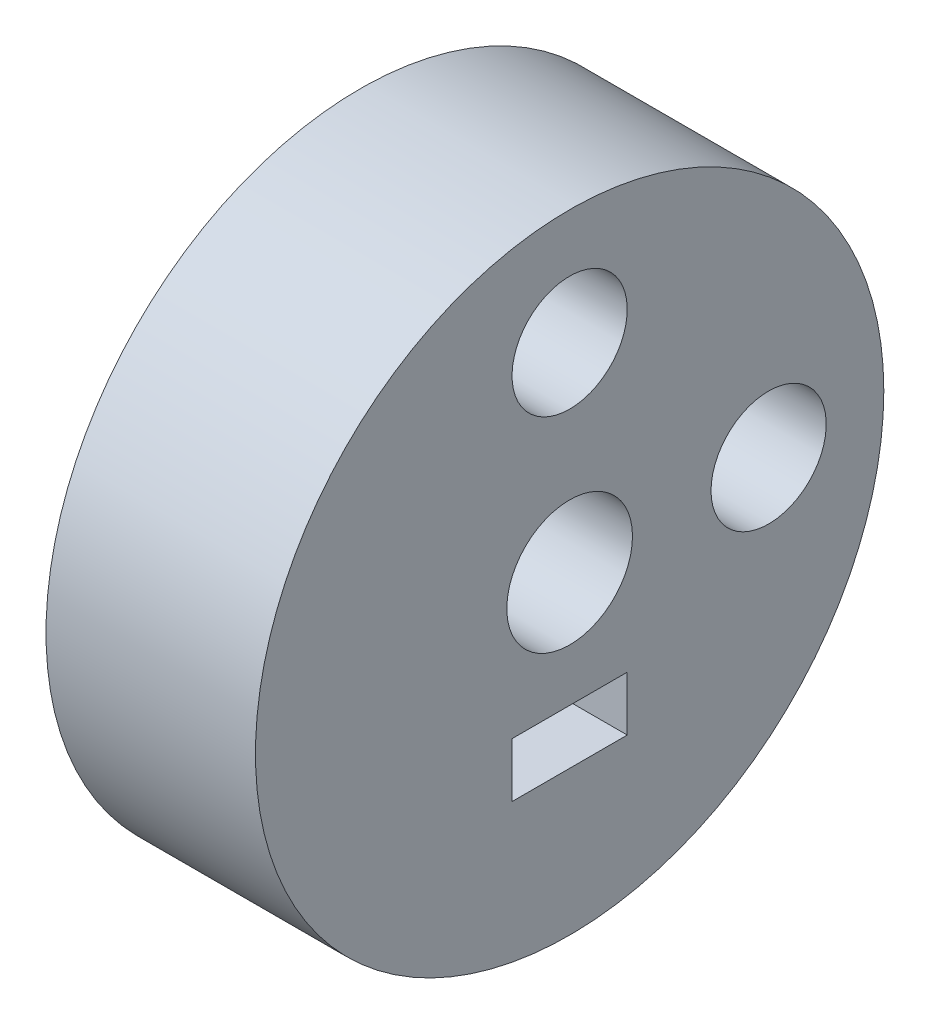
ISO-10303-21;
HEADER;
FILE_DESCRIPTION(('STEP AP214'),'2;1');
FILE_NAME('part.step','',(''),(''),'','','');
FILE_SCHEMA(('AUTOMOTIVE_DESIGN { 1 0 10303 214 1 1 1 1 }'));
ENDSEC;
DATA;
#1=APPLICATION_CONTEXT('core data for automotive mechanical design processes');
#2=APPLICATION_PROTOCOL_DEFINITION('international standard','automotive_design',2000,#1);
#3=PRODUCT_CONTEXT('',#1,'mechanical');
#4=PRODUCT('Part','Part','',(#3));
#5=PRODUCT_RELATED_PRODUCT_CATEGORY('part','',(#4));
#6=PRODUCT_DEFINITION_FORMATION('','',#4);
#7=PRODUCT_DEFINITION_CONTEXT('part definition',#1,'design');
#8=PRODUCT_DEFINITION('design','',#6,#7);
#9=PRODUCT_DEFINITION_SHAPE('','',#8);
#10=(LENGTH_UNIT() NAMED_UNIT(*) SI_UNIT(.MILLI.,.METRE.));
#11=(NAMED_UNIT(*) PLANE_ANGLE_UNIT() SI_UNIT($,.RADIAN.));
#12=(NAMED_UNIT(*) SI_UNIT($,.STERADIAN.) SOLID_ANGLE_UNIT());
#13=UNCERTAINTY_MEASURE_WITH_UNIT(LENGTH_MEASURE(1.E-05),#10,'distance_accuracy_value','');
#14=(GEOMETRIC_REPRESENTATION_CONTEXT(3) GLOBAL_UNCERTAINTY_ASSIGNED_CONTEXT((#13)) GLOBAL_UNIT_ASSIGNED_CONTEXT((#10,
#11,#12)) REPRESENTATION_CONTEXT('',''));
#15=CARTESIAN_POINT('',(0.,0.,0.));
#16=DIRECTION('',(0.,0.,1.));
#17=DIRECTION('',(1.,0.,0.));
#18=AXIS2_PLACEMENT_3D('',#15,#16,#17);
#19=CARTESIAN_POINT('',(-5.,-15.,0.));
#20=DIRECTION('',(0.,1.,0.));
#21=DIRECTION('',(0.,0.,1.));
#22=AXIS2_PLACEMENT_3D('',#19,#20,#21);
#23=CYLINDRICAL_SURFACE('',#22,1.5);
#24=CARTESIAN_POINT('',(-5.,-5.5,0.));
#25=DIRECTION('',(0.,1.,0.));
#26=DIRECTION('',(0.,0.,1.));
#27=AXIS2_PLACEMENT_3D('',#24,#25,#26);
#28=CIRCLE('',#27,1.5);
#29=CARTESIAN_POINT('',(-5.,-5.5,1.5));
#30=VERTEX_POINT('',#29);
#31=EDGE_CURVE('E164',#30,#30,#28,.F.);
#32=ORIENTED_EDGE('',*,*,#31,.T.);
#33=EDGE_LOOP('',(#32));
#34=FACE_BOUND('',#33,.T.);
#35=CARTESIAN_POINT('',(-5.,-2.59807621135331,1.5));
#36=CARTESIAN_POINT('',(-5.07816171229288,-2.59808302092689,1.4999945446118));
#37=CARTESIAN_POINT('',(-5.15642211728757,-2.60165701781635,1.49384995609983));
#38=CARTESIAN_POINT('',(-5.31054089701573,-2.61543549678078,1.46958481484708));
#39=CARTESIAN_POINT('',(-5.38639387256511,-2.62565391083339,1.45143909683127));
#40=CARTESIAN_POINT('',(-5.53317749651591,-2.65124019908097,1.40414992304972));
#41=CARTESIAN_POINT('',(-5.60413197871038,-2.66658065209878,1.3750649287406));
#42=CARTESIAN_POINT('',(-5.74013630299508,-2.70063997225287,1.30690128806456));
#43=CARTESIAN_POINT('',(-5.80518582539369,-2.71935902214097,1.26782210105366));
#44=CARTESIAN_POINT('',(-5.93345859283626,-2.75995303586162,1.17699981079632));
#45=CARTESIAN_POINT('',(-5.99608870351032,-2.7819609545693,1.12447805421566));
#46=CARTESIAN_POINT('',(-6.11211258261007,-2.82557974178558,1.0098807114217));
#47=CARTESIAN_POINT('',(-6.16550174387528,-2.84719040746875,0.947800388673441));
#48=CARTESIAN_POINT('',(-6.26505072672149,-2.88932215429423,0.810734345121821));
#49=CARTESIAN_POINT('',(-6.3104806517893,-2.90967159627258,0.735160783518864));
#50=CARTESIAN_POINT('',(-6.38771127986865,-2.94526134149293,0.576235539899257));
#51=CARTESIAN_POINT('',(-6.41952058420576,-2.96050486775612,0.492888807207234));
#52=CARTESIAN_POINT('',(-6.46625699195165,-2.98320691866356,0.327067415888967));
#53=CARTESIAN_POINT('',(-6.4822242895333,-2.99114220331338,0.244952685733227));
#54=CARTESIAN_POINT('',(-6.50024917801256,-3.000113757691,0.0788559430467733));
#55=CARTESIAN_POINT('',(-6.50231518519357,-3.00115420176885,-0.00512490876560655));
#56=CARTESIAN_POINT('',(-6.49287998904448,-2.99644472874675,-0.164748786635624));
#57=CARTESIAN_POINT('',(-6.48254297671817,-2.99127743838241,-0.240481798765186));
#58=CARTESIAN_POINT('',(-6.45067873414302,-2.97561367889621,-0.388970657877482));
#59=CARTESIAN_POINT('',(-6.42915066653567,-2.96511681099591,-0.461726281640887));
#60=CARTESIAN_POINT('',(-6.37537615086528,-2.93957374931481,-0.603464087354329));
#61=CARTESIAN_POINT('',(-6.3429855302419,-2.92446662293799,-0.672380135272767));
#62=CARTESIAN_POINT('',(-6.26860487569776,-2.89106468980031,-0.803965202269992));
#63=CARTESIAN_POINT('',(-6.22661140504648,-2.87276874236226,-0.866631973257968));
#64=CARTESIAN_POINT('',(-6.12965697270048,-2.83266591598844,-0.990260491347292));
#65=CARTESIAN_POINT('',(-6.07384545751099,-2.81069063997263,-1.05050111254404));
#66=CARTESIAN_POINT('',(-5.95311541260474,-2.76681510880217,-1.16115655544667));
#67=CARTESIAN_POINT('',(-5.88818994158891,-2.74491492398443,-1.21156381736135));
#68=CARTESIAN_POINT('',(-5.74602771136387,-2.70216234138727,-1.30425800196332));
#69=CARTESIAN_POINT('',(-5.66827096541869,-2.68146479986061,-1.34582597246708));
#70=CARTESIAN_POINT('',(-5.50559349296151,-2.64563175417864,-1.41497866950185));
#71=CARTESIAN_POINT('',(-5.42068035047366,-2.63049045069101,-1.44257798731633));
#72=CARTESIAN_POINT('',(-5.25317823307582,-2.60916953725551,-1.48077031653756));
#73=CARTESIAN_POINT('',(-5.17093832143467,-2.60237483772744,-1.49253768317996));
#74=CARTESIAN_POINT('',(-5.00539798772519,-2.59676879042414,-1.50227541991714));
#75=CARTESIAN_POINT('',(-4.92209835632032,-2.59795180333967,-1.50025553597254));
#76=CARTESIAN_POINT('',(-4.76651912213191,-2.60751504810877,-1.48355406501595));
#77=CARTESIAN_POINT('',(-4.69403082333811,-2.61509381259981,-1.4702817250687));
#78=CARTESIAN_POINT('',(-4.55244832059356,-2.63541032327011,-1.43354442694866));
#79=CARTESIAN_POINT('',(-4.48335522388009,-2.64814974007551,-1.41007616793542));
#80=CARTESIAN_POINT('',(-4.34688300364596,-2.67804333119485,-1.35247138290733));
#81=CARTESIAN_POINT('',(-4.27973147471967,-2.69537464864595,-1.31789109553908));
#82=CARTESIAN_POINT('',(-4.15179609269151,-2.73234179245874,-1.23943059602371));
#83=CARTESIAN_POINT('',(-4.09101553473008,-2.75197880032721,-1.19554560649832));
#84=CARTESIAN_POINT('',(-3.96953184871468,-2.79431997684504,-1.09325575079828));
#85=CARTESIAN_POINT('',(-3.90980427392351,-2.81709874731433,-1.03371790847245));
#86=CARTESIAN_POINT('',(-3.80088164300961,-2.86101352466839,-0.905106743097434));
#87=CARTESIAN_POINT('',(-3.75169014465419,-2.88214897511564,-0.836030211983021));
#88=CARTESIAN_POINT('',(-3.66413941107485,-2.92112042536435,-0.687803043838136));
#89=CARTESIAN_POINT('',(-3.62610032268364,-2.93885462508044,-0.60843464636117));
#90=CARTESIAN_POINT('',(-3.56429314421391,-2.96825032438951,-0.443283546961623));
#91=CARTESIAN_POINT('',(-3.54051252295054,-2.97991715514559,-0.357506552088264));
#92=CARTESIAN_POINT('',(-3.50994715373801,-2.99501262272824,-0.190469523495626));
#93=CARTESIAN_POINT('',(-3.50180318618583,-2.99909891862287,-0.109517165775686));
#94=CARTESIAN_POINT('',(-3.4987351018184,-3.00063195562697,0.0526889789268054));
#95=CARTESIAN_POINT('',(-3.50380635721465,-2.99808102100335,0.13394265044263));
#96=CARTESIAN_POINT('',(-3.52612461019344,-2.98700953256884,0.288806988475721));
#97=CARTESIAN_POINT('',(-3.54254727388651,-2.97889342001985,0.362568476716896));
#98=CARTESIAN_POINT('',(-3.58599049895446,-2.95788140495135,0.506168928275426));
#99=CARTESIAN_POINT('',(-3.61301258014018,-2.94498481699193,0.576007327433263));
#100=CARTESIAN_POINT('',(-3.67809057824896,-2.9148889612218,0.713135109367327));
#101=CARTESIAN_POINT('',(-3.71656898481176,-2.89752925798198,0.780187714050069));
#102=CARTESIAN_POINT('',(-3.80293689628858,-2.86032199712739,0.907161962721037));
#103=CARTESIAN_POINT('',(-3.85083072367351,-2.84047329837541,0.967080311122361));
#104=CARTESIAN_POINT('',(-3.96019570853405,-2.79792915339941,1.08437100623534));
#105=CARTESIAN_POINT('',(-4.02254373121579,-2.77514698517547,1.14089652680891));
#106=CARTESIAN_POINT('',(-4.15617608169465,-2.73094614244278,1.24299493109201));
#107=CARTESIAN_POINT('',(-4.22746823130153,-2.70952868642798,1.28855812501509));
#108=CARTESIAN_POINT('',(-4.37995496987143,-2.66999407957374,1.36864661967848));
#109=CARTESIAN_POINT('',(-4.4613912966931,-2.65200261384405,1.40277759894141));
#110=CARTESIAN_POINT('',(-4.62999860650967,-2.62299234492527,1.45631806425962));
#111=CARTESIAN_POINT('',(-4.71714933336903,-2.61195024221553,1.47577678676302));
#112=CARTESIAN_POINT('',(-4.83770803347799,-2.60293908902686,1.49155051179662));
#113=CARTESIAN_POINT('',(-4.87005184159682,-2.60112193507727,1.49471415744578));
#114=CARTESIAN_POINT('',(-4.93492472102337,-2.59868903831625,1.49894010763495));
#115=CARTESIAN_POINT('',(-4.96745380457881,-2.59807337587664,1.50000227159981));
#116=CARTESIAN_POINT('',(-5.,-2.59807621135331,1.5));
#117=B_SPLINE_CURVE_WITH_KNOTS('',3,(#35,#36,#37,#38,#39,#40,#41,#42,#43,#44,#45,#46,#47,#48,
#49,#50,#51,#52,#53,#54,#55,#56,#57,#58,#59,#60,#61,#62,#63,#64,#65,#66,#67,#68,#69,#70,#71,#72,
#73,#74,#75,#76,#77,#78,#79,#80,#81,#82,#83,#84,#85,#86,#87,#88,#89,#90,#91,#92,#93,#94,#95,#96,
#97,#98,#99,#100,#101,#102,#103,#104,#105,#106,#107,#108,#109,#110,#111,#112,#113,#114,#115,
#116),.UNSPECIFIED.,.T.,.F.,(4,2,2,2,2,2,2,2,2,2,2,2,2,2,2,2,2,2,2,2,2,2,2,2,2,2,2,2,2,2,2,2,2,
2,2,2,2,2,2,2,4),(0.,0.234348183892073,0.469189339237207,0.702792893878328,0.936409088167725,
1.18929346874735,1.44230356626556,1.71236838358145,1.98226240445837,2.23295227451903,
2.4834903552906,2.71224146226808,2.94100968776183,3.1729430209672,3.40495949025408,
3.65890787185336,3.91305072368878,4.18333262594173,4.45333161317558,4.70193436281318,
4.9503613978256,5.17161275136039,5.39293578654095,5.62450944609132,5.85620229330071,
6.1171011537092,6.37808797467304,6.64596272119449,6.91360169713158,7.15668405584231,
7.39968130190958,7.62666637307239,7.8536840026802,8.09041126079208,8.32724745151079,
8.58765362775102,8.84828914267732,9.11716123557908,9.38512699504141,9.48270202777964,
9.58028358741811),.UNSPECIFIED.);
#118=CARTESIAN_POINT('',(-5.,-2.59807621135331,1.5));
#119=VERTEX_POINT('',#118);
#120=EDGE_CURVE('E149',#119,#119,#117,.T.);
#121=ORIENTED_EDGE('',*,*,#120,.F.);
#122=EDGE_LOOP('',(#121));
#123=FACE_BOUND('',#122,.T.);
#124=ADVANCED_FACE('F41',(#34,#123),#23,.F.);
#125=CARTESIAN_POINT('',(-10.,0.,0.));
#126=DIRECTION('',(1.,0.,0.));
#127=DIRECTION('',(0.,0.,-1.));
#128=AXIS2_PLACEMENT_3D('',#125,#126,#127);
#129=CYLINDRICAL_SURFACE('',#128,15.);
#130=CARTESIAN_POINT('',(-2.25,-15.,0.));
#131=CARTESIAN_POINT('',(-2.25000591468106,-14.9999972510161,0.153093900309382));
#132=CARTESIAN_POINT('',(-2.26282742180987,-14.9976319814164,0.306265477031471));
#133=CARTESIAN_POINT('',(-2.31374411502345,-14.9884243838124,0.608296581609692));
#134=CARTESIAN_POINT('',(-2.35186103096257,-14.9815782065834,0.757152287098164));
#135=CARTESIAN_POINT('',(-2.45216567272287,-14.9641750561343,1.04613957267399));
#136=CARTESIAN_POINT('',(-2.51433208495394,-14.9536213694109,1.18627875038933));
#137=CARTESIAN_POINT('',(-2.6609114945878,-14.9299573070775,1.45412377239283));
#138=CARTESIAN_POINT('',(-2.7453225372964,-14.9168471561369,1.58183070778522));
#139=CARTESIAN_POINT('',(-2.93502351535757,-14.8893503502405,1.82266517260927));
#140=CARTESIAN_POINT('',(-3.04051905667183,-14.8749519639975,1.93562942750799));
#141=CARTESIAN_POINT('',(-3.26895204249587,-14.846589106181,2.1423598358931));
#142=CARTESIAN_POINT('',(-3.39189070575394,-14.8326246650105,2.23612464679788));
#143=CARTESIAN_POINT('',(-3.65286736513593,-14.806596889458,2.40246850585389));
#144=CARTESIAN_POINT('',(-3.79101225544001,-14.7945486888178,2.47488242385847));
#145=CARTESIAN_POINT('',(-4.077764222431,-14.7738823438178,2.59541207444971));
#146=CARTESIAN_POINT('',(-4.22637043712512,-14.7652639172396,2.64352980633092));
#147=CARTESIAN_POINT('',(-4.52808291059042,-14.7525507605405,2.71357916395669));
#148=CARTESIAN_POINT('',(-4.68112108624922,-14.7484069777176,2.73579495609452));
#149=CARTESIAN_POINT('',(-4.98880450626698,-14.7449642976523,2.75429164488095));
#150=CARTESIAN_POINT('',(-5.1434496117774,-14.7456649852374,2.75057476396706));
#151=CARTESIAN_POINT('',(-5.44790470227485,-14.7517873897883,2.71754225390076));
#152=CARTESIAN_POINT('',(-5.59775102791049,-14.7571496633628,2.68854893050182));
#153=CARTESIAN_POINT('',(-5.8904159209095,-14.7718977460441,2.60629376146578));
#154=CARTESIAN_POINT('',(-6.03323420130803,-14.7812837192925,2.55303092578027));
#155=CARTESIAN_POINT('',(-6.30873652086394,-14.8030842132271,2.42343106244702));
#156=CARTESIAN_POINT('',(-6.4413575680781,-14.8155158372729,2.34696312277099));
#157=CARTESIAN_POINT('',(-6.69200763552081,-14.841995479548,2.17321635395305));
#158=CARTESIAN_POINT('',(-6.81003523611292,-14.8560436547777,2.0759355026605));
#159=CARTESIAN_POINT('',(-7.03001097629595,-14.8844329978704,1.86158278548887));
#160=CARTESIAN_POINT('',(-7.13169033890665,-14.8987753930112,1.74423505835852));
#161=CARTESIAN_POINT('',(-7.31395951306651,-14.925942587441,1.4940048020683));
#162=CARTESIAN_POINT('',(-7.3945491304202,-14.9387673727553,1.36112212987815));
#163=CARTESIAN_POINT('',(-7.53238758088352,-14.9614785343155,1.08331945609412));
#164=CARTESIAN_POINT('',(-7.5896093412353,-14.9713614987523,0.9383857253412));
#165=CARTESIAN_POINT('',(-7.67882070354032,-14.9870489254352,0.64074215563138));
#166=CARTESIAN_POINT('',(-7.71081286628573,-14.9928538015987,0.488033107540903));
#167=CARTESIAN_POINT('',(-7.74828482446857,-14.999674394813,0.181487011493798));
#168=CARTESIAN_POINT('',(-7.75413303130869,-15.0007566560472,0.0276964296714097));
#169=CARTESIAN_POINT('',(-7.74013803517298,-14.9981935681186,-0.278665448088021));
#170=CARTESIAN_POINT('',(-7.72029603679185,-14.9945484406195,-0.431236800856306));
#171=CARTESIAN_POINT('',(-7.65579020935913,-14.9829815288907,-0.729667119843815));
#172=CARTESIAN_POINT('',(-7.61131195691967,-14.9750917309389,-0.875567546148179));
#173=CARTESIAN_POINT('',(-7.498996391081,-14.9559164615322,-1.15784057542715));
#174=CARTESIAN_POINT('',(-7.43115754667096,-14.9446307675224,-1.2942125532197));
#175=CARTESIAN_POINT('',(-7.27322517694902,-14.9197496308965,-1.55513574711322));
#176=CARTESIAN_POINT('',(-7.18290548730028,-14.9061311832108,-1.67954783176349));
#177=CARTESIAN_POINT('',(-6.98288235989544,-14.8781564261892,-1.91158174162422));
#178=CARTESIAN_POINT('',(-6.87317719706531,-14.8638000512674,-2.01920207096415));
#179=CARTESIAN_POINT('',(-6.63583251499331,-14.8357478861322,-2.21599031166315));
#180=CARTESIAN_POINT('',(-6.50798348921652,-14.8220627626441,-2.30490730970727));
#181=CARTESIAN_POINT('',(-6.23894711661704,-14.7971139270277,-2.46000320854517));
#182=CARTESIAN_POINT('',(-6.09776025192612,-14.7858501274224,-2.52618293083776));
#183=CARTESIAN_POINT('',(-5.80670643830746,-14.7671022238965,-2.63356582199303));
#184=CARTESIAN_POINT('',(-5.65688387126149,-14.7596004330393,-2.67488605357941));
#185=CARTESIAN_POINT('',(-5.35227306034881,-14.7491846618503,-2.73173972305749));
#186=CARTESIAN_POINT('',(-5.19748535118729,-14.746270189183,-2.74727592823777));
#187=CARTESIAN_POINT('',(-4.88984971865139,-14.7453832417835,-2.75203112062691));
#188=CARTESIAN_POINT('',(-4.73700798344466,-14.7473364789301,-2.74164570461817));
#189=CARTESIAN_POINT('',(-4.43528784285571,-14.7558005449872,-2.69571632129616));
#190=CARTESIAN_POINT('',(-4.28640941623177,-14.7623113494658,-2.66017248884988));
#191=CARTESIAN_POINT('',(-3.99704233923948,-14.77912629148,-2.56509900456574));
#192=CARTESIAN_POINT('',(-3.85653981227977,-14.7894239401242,-2.50561036660688));
#193=CARTESIAN_POINT('',(-3.58744620382028,-14.8126571946771,-2.36437859792739));
#194=CARTESIAN_POINT('',(-3.45885591319908,-14.8255929755548,-2.28263399100306));
#195=CARTESIAN_POINT('',(-3.21525172773682,-14.8528765997566,-2.0978277127801));
#196=CARTESIAN_POINT('',(-3.10045869249177,-14.8672420157936,-1.99447745967803));
#197=CARTESIAN_POINT('',(-2.88971188943599,-14.8956330460934,-1.76999701075032));
#198=CARTESIAN_POINT('',(-2.79376245747521,-14.9096585815014,-1.64886273405945));
#199=CARTESIAN_POINT('',(-2.62266313171063,-14.9359299285687,-1.39101348593272));
#200=CARTESIAN_POINT('',(-2.54769810906176,-14.9481594964018,-1.25417414215704));
#201=CARTESIAN_POINT('',(-2.42194034874333,-14.9693025840877,-0.969665515548213));
#202=CARTESIAN_POINT('',(-2.37112461768458,-14.9782192564921,-0.822006689596414));
#203=CARTESIAN_POINT('',(-2.30557576741828,-14.9898870166686,-0.561569345065889));
#204=CARTESIAN_POINT('',(-2.28476999556536,-14.9936582109843,-0.450325182223649));
#205=CARTESIAN_POINT('',(-2.25698009068607,-14.9987156884134,-0.22606810507163));
#206=CARTESIAN_POINT('',(-2.24999563218626,-15.0000020300418,-0.11305523247577));
#207=CARTESIAN_POINT('',(-2.25,-15.,0.));
#208=B_SPLINE_CURVE_WITH_KNOTS('',3,(#130,#131,#132,#133,#134,#135,#136,#137,#138,#139,#140,
#141,#142,#143,#144,#145,#146,#147,#148,#149,#150,#151,#152,#153,#154,#155,#156,#157,#158,#159,
#160,#161,#162,#163,#164,#165,#166,#167,#168,#169,#170,#171,#172,#173,#174,#175,#176,#177,#178,
#179,#180,#181,#182,#183,#184,#185,#186,#187,#188,#189,#190,#191,#192,#193,#194,#195,#196,#197,
#198,#199,#200,#201,#202,#203,#204,#205,#206,#207),.UNSPECIFIED.,.T.,.F.,(4,2,2,2,2,2,2,2,2,2,2,
2,2,2,2,2,2,2,2,2,2,2,2,2,2,2,2,2,2,2,2,2,2,2,2,2,2,2,4),(0.,0.458868293555029,
0.918131286043314,1.3769881909667,1.83580478836417,2.29933541685647,2.76289844812701,
3.229957951066,3.69697901415468,4.15882675594148,4.62063491773038,5.07663918981195,
5.53266206575834,5.9913070007015,6.44999651713749,6.91559042164643,7.38118861321736,
7.8473247021737,8.31341347244666,8.77291314846164,9.23239127965722,9.68845448154878,
10.1445475786857,10.6054289837685,11.0663514224279,11.5331103751803,11.9998524621365,
12.4643791099844,12.9288558989615,13.3862876548278,13.8437169585536,14.3003660658135,
14.757045469278,15.2202665479048,15.6835940875909,16.1508835105106,16.6177271148917,
16.956595503423,17.2954559119617),.UNSPECIFIED.);
#209=CARTESIAN_POINT('',(-2.25,-15.,0.));
#210=VERTEX_POINT('',#209);
#211=EDGE_CURVE('E11',#210,#210,#208,.T.);
#212=ORIENTED_EDGE('',*,*,#211,.F.);
#213=EDGE_LOOP('',(#212));
#214=FACE_BOUND('',#213,.T.);
#215=CARTESIAN_POINT('',(-10.,0.,0.));
#216=DIRECTION('',(1.,0.,0.));
#217=DIRECTION('',(0.,0.,-1.));
#218=AXIS2_PLACEMENT_3D('',#215,#216,#217);
#219=CIRCLE('',#218,15.);
#220=CARTESIAN_POINT('',(-10.,0.,-15.));
#221=VERTEX_POINT('',#220);
#222=EDGE_CURVE('E52',#221,#221,#219,.T.);
#223=ORIENTED_EDGE('',*,*,#222,.T.);
#224=EDGE_LOOP('',(#223));
#225=FACE_BOUND('',#224,.T.);
#226=CARTESIAN_POINT('',(0.,0.,0.));
#227=DIRECTION('',(1.,0.,0.));
#228=DIRECTION('',(0.,0.,-1.));
#229=AXIS2_PLACEMENT_3D('',#226,#227,#228);
#230=CIRCLE('',#229,15.);
#231=CARTESIAN_POINT('',(0.,0.,-15.));
#232=VERTEX_POINT('',#231);
#233=EDGE_CURVE('E144',#232,#232,#230,.T.);
#234=ORIENTED_EDGE('',*,*,#233,.F.);
#235=EDGE_LOOP('',(#234));
#236=FACE_BOUND('',#235,.T.);
#237=ADVANCED_FACE('F43',(#214,#225,#236),#129,.T.);
#238=CARTESIAN_POINT('',(-10.,0.,0.));
#239=DIRECTION('',(1.,0.,0.));
#240=DIRECTION('',(0.,0.,-1.));
#241=AXIS2_PLACEMENT_3D('',#238,#239,#240);
#242=PLANE('',#241);
#243=CARTESIAN_POINT('',(-10.,9.5,0.));
#244=DIRECTION('',(-1.,0.,0.));
#245=DIRECTION('',(0.,1.,0.));
#246=AXIS2_PLACEMENT_3D('',#243,#244,#245);
#247=CIRCLE('',#246,1.5);
#248=CARTESIAN_POINT('',(-10.,11.,0.));
#249=VERTEX_POINT('',#248);
#250=EDGE_CURVE('E214',#249,#249,#247,.T.);
#251=ORIENTED_EDGE('',*,*,#250,.F.);
#252=EDGE_LOOP('',(#251));
#253=FACE_BOUND('',#252,.T.);
#254=CARTESIAN_POINT('',(-10.,0.,-9.5));
#255=DIRECTION('',(1.,0.,0.));
#256=DIRECTION('',(0.,0.,-1.));
#257=AXIS2_PLACEMENT_3D('',#254,#255,#256);
#258=CIRCLE('',#257,1.5);
#259=CARTESIAN_POINT('',(-10.,0.,-11.));
#260=VERTEX_POINT('',#259);
#261=EDGE_CURVE('E200',#260,#260,#258,.T.);
#262=ORIENTED_EDGE('',*,*,#261,.T.);
#263=EDGE_LOOP('',(#262));
#264=FACE_BOUND('',#263,.T.);
#265=DIRECTION('',(0.,0.,1.));
#266=VECTOR('',#265,1.);
#267=CARTESIAN_POINT('',(-10.,-5.5,-2.75));
#268=LINE('',#267,#266);
#269=CARTESIAN_POINT('',(-10.,-5.5,-2.75));
#270=VERTEX_POINT('',#269);
#271=CARTESIAN_POINT('',(-10.,-5.5,2.75));
#272=VERTEX_POINT('',#271);
#273=EDGE_CURVE('E95',#270,#272,#268,.T.);
#274=ORIENTED_EDGE('',*,*,#273,.T.);
#275=DIRECTION('',(0.,-1.,0.));
#276=VECTOR('',#275,1.);
#277=CARTESIAN_POINT('',(-10.,-8.1,2.75));
#278=LINE('',#277,#276);
#279=CARTESIAN_POINT('',(-10.,-8.1,2.75));
#280=VERTEX_POINT('',#279);
#281=EDGE_CURVE('E88',#272,#280,#278,.T.);
#282=ORIENTED_EDGE('',*,*,#281,.T.);
#283=DIRECTION('',(0.,0.,-1.));
#284=VECTOR('',#283,1.);
#285=CARTESIAN_POINT('',(-10.,-8.1,-2.75));
#286=LINE('',#285,#284);
#287=CARTESIAN_POINT('',(-10.,-8.1,-2.75));
#288=VERTEX_POINT('',#287);
#289=EDGE_CURVE('E98',#280,#288,#286,.T.);
#290=ORIENTED_EDGE('',*,*,#289,.T.);
#291=DIRECTION('',(0.,1.,0.));
#292=VECTOR('',#291,1.);
#293=CARTESIAN_POINT('',(-10.,-8.1,-2.75));
#294=LINE('',#293,#292);
#295=EDGE_CURVE('E60',#288,#270,#294,.T.);
#296=ORIENTED_EDGE('',*,*,#295,.T.);
#297=EDGE_LOOP('',(#274,#282,#290,#296));
#298=FACE_BOUND('',#297,.T.);
#299=CARTESIAN_POINT('',(-10.,0.,0.));
#300=DIRECTION('',(1.,0.,0.));
#301=DIRECTION('',(0.,0.,-1.));
#302=AXIS2_PLACEMENT_3D('',#299,#300,#301);
#303=CIRCLE('',#302,3.);
#304=CARTESIAN_POINT('',(-10.,0.,-3.));
#305=VERTEX_POINT('',#304);
#306=EDGE_CURVE('E140',#305,#305,#303,.T.);
#307=ORIENTED_EDGE('',*,*,#306,.T.);
#308=EDGE_LOOP('',(#307));
#309=FACE_BOUND('',#308,.T.);
#310=ORIENTED_EDGE('',*,*,#222,.F.);
#311=EDGE_LOOP('',(#310));
#312=FACE_BOUND('',#311,.T.);
#313=ADVANCED_FACE('F104',(#253,#264,#298,#309,#312),#242,.F.);
#314=CARTESIAN_POINT('',(0.,0.,0.));
#315=DIRECTION('',(1.,0.,0.));
#316=DIRECTION('',(0.,0.,-1.));
#317=AXIS2_PLACEMENT_3D('',#314,#315,#316);
#318=PLANE('',#317);
#319=CARTESIAN_POINT('',(0.,9.5,0.));
#320=DIRECTION('',(1.,0.,0.));
#321=DIRECTION('',(0.,-1.,0.));
#322=AXIS2_PLACEMENT_3D('',#319,#320,#321);
#323=CIRCLE('',#322,2.75);
#324=CARTESIAN_POINT('',(0.,6.75,0.));
#325=VERTEX_POINT('',#324);
#326=EDGE_CURVE('E224',#325,#325,#323,.T.);
#327=ORIENTED_EDGE('',*,*,#326,.F.);
#328=EDGE_LOOP('',(#327));
#329=FACE_BOUND('',#328,.T.);
#330=CARTESIAN_POINT('',(0.,0.,-9.5));
#331=DIRECTION('',(-1.,0.,0.));
#332=DIRECTION('',(0.,0.,1.));
#333=AXIS2_PLACEMENT_3D('',#330,#331,#332);
#334=CIRCLE('',#333,2.75);
#335=CARTESIAN_POINT('',(0.,0.,-6.75));
#336=VERTEX_POINT('',#335);
#337=EDGE_CURVE('E201',#336,#336,#334,.T.);
#338=ORIENTED_EDGE('',*,*,#337,.T.);
#339=EDGE_LOOP('',(#338));
#340=FACE_BOUND('',#339,.T.);
#341=DIRECTION('',(0.,-1.,0.));
#342=VECTOR('',#341,1.);
#343=CARTESIAN_POINT('',(0.,-8.1,2.75));
#344=LINE('',#343,#342);
#345=CARTESIAN_POINT('',(0.,-5.5,2.75));
#346=VERTEX_POINT('',#345);
#347=CARTESIAN_POINT('',(0.,-8.1,2.75));
#348=VERTEX_POINT('',#347);
#349=EDGE_CURVE('E68',#346,#348,#344,.T.);
#350=ORIENTED_EDGE('',*,*,#349,.F.);
#351=DIRECTION('',(0.,0.,1.));
#352=VECTOR('',#351,1.);
#353=CARTESIAN_POINT('',(0.,-5.5,-2.75));
#354=LINE('',#353,#352);
#355=CARTESIAN_POINT('',(0.,-5.5,-2.75));
#356=VERTEX_POINT('',#355);
#357=EDGE_CURVE('E108',#356,#346,#354,.T.);
#358=ORIENTED_EDGE('',*,*,#357,.F.);
#359=DIRECTION('',(0.,1.,0.));
#360=VECTOR('',#359,1.);
#361=CARTESIAN_POINT('',(0.,-8.1,-2.75));
#362=LINE('',#361,#360);
#363=CARTESIAN_POINT('',(0.,-8.1,-2.75));
#364=VERTEX_POINT('',#363);
#365=EDGE_CURVE('E112',#364,#356,#362,.T.);
#366=ORIENTED_EDGE('',*,*,#365,.F.);
#367=DIRECTION('',(0.,0.,-1.));
#368=VECTOR('',#367,1.);
#369=CARTESIAN_POINT('',(0.,-8.1,-2.75));
#370=LINE('',#369,#368);
#371=EDGE_CURVE('E124',#348,#364,#370,.T.);
#372=ORIENTED_EDGE('',*,*,#371,.F.);
#373=EDGE_LOOP('',(#350,#358,#366,#372));
#374=FACE_BOUND('',#373,.T.);
#375=CARTESIAN_POINT('',(0.,0.,0.));
#376=DIRECTION('',(1.,0.,0.));
#377=DIRECTION('',(0.,0.,-1.));
#378=AXIS2_PLACEMENT_3D('',#375,#376,#377);
#379=CIRCLE('',#378,3.);
#380=CARTESIAN_POINT('',(0.,0.,-3.));
#381=VERTEX_POINT('',#380);
#382=EDGE_CURVE('E145',#381,#381,#379,.T.);
#383=ORIENTED_EDGE('',*,*,#382,.F.);
#384=EDGE_LOOP('',(#383));
#385=FACE_BOUND('',#384,.T.);
#386=ORIENTED_EDGE('',*,*,#233,.T.);
#387=EDGE_LOOP('',(#386));
#388=FACE_BOUND('',#387,.T.);
#389=ADVANCED_FACE('F246',(#329,#340,#374,#385,#388),#318,.T.);
#390=CARTESIAN_POINT('',(-10.,0.,0.));
#391=DIRECTION('',(1.,0.,0.));
#392=DIRECTION('',(0.,0.,-1.));
#393=AXIS2_PLACEMENT_3D('',#390,#391,#392);
#394=CYLINDRICAL_SURFACE('',#393,3.);
#395=ORIENTED_EDGE('',*,*,#120,.T.);
#396=EDGE_LOOP('',(#395));
#397=FACE_BOUND('',#396,.T.);
#398=ORIENTED_EDGE('',*,*,#306,.F.);
#399=EDGE_LOOP('',(#398));
#400=FACE_BOUND('',#399,.T.);
#401=ORIENTED_EDGE('',*,*,#382,.T.);
#402=EDGE_LOOP('',(#401));
#403=FACE_BOUND('',#402,.T.);
#404=ADVANCED_FACE('F166',(#397,#400,#403),#394,.F.);
#405=CARTESIAN_POINT('',(-5.,-11.5,0.));
#406=DIRECTION('',(0.,1.,0.));
#407=DIRECTION('',(0.,0.,1.));
#408=AXIS2_PLACEMENT_3D('',#405,#406,#407);
#409=CIRCLE('',#408,1.5);
#410=CARTESIAN_POINT('',(-5.,-11.5,1.5));
#411=VERTEX_POINT('',#410);
#412=EDGE_CURVE('E125',#411,#411,#409,.F.);
#413=ORIENTED_EDGE('',*,*,#412,.T.);
#414=EDGE_LOOP('',(#413));
#415=FACE_BOUND('',#414,.T.);
#416=CARTESIAN_POINT('',(-5.,-8.1,0.));
#417=DIRECTION('',(0.,-1.,0.));
#418=DIRECTION('',(0.,0.,-1.));
#419=AXIS2_PLACEMENT_3D('',#416,#417,#418);
#420=CIRCLE('',#419,1.5);
#421=CARTESIAN_POINT('',(-5.,-8.1,-1.5));
#422=VERTEX_POINT('',#421);
#423=EDGE_CURVE('E134',#422,#422,#420,.F.);
#424=ORIENTED_EDGE('',*,*,#423,.T.);
#425=EDGE_LOOP('',(#424));
#426=FACE_BOUND('',#425,.T.);
#427=ADVANCED_FACE('F169',(#415,#426),#23,.F.);
#428=CARTESIAN_POINT('',(-10.,-5.5,-2.75));
#429=DIRECTION('',(0.,1.,0.));
#430=DIRECTION('',(0.,0.,1.));
#431=AXIS2_PLACEMENT_3D('',#428,#429,#430);
#432=PLANE('',#431);
#433=ORIENTED_EDGE('',*,*,#357,.T.);
#434=DIRECTION('',(1.,0.,0.));
#435=VECTOR('',#434,1.);
#436=CARTESIAN_POINT('',(-10.,-5.5,2.75));
#437=LINE('',#436,#435);
#438=EDGE_CURVE('E131',#272,#346,#437,.T.);
#439=ORIENTED_EDGE('',*,*,#438,.F.);
#440=ORIENTED_EDGE('',*,*,#273,.F.);
#441=DIRECTION('',(1.,0.,0.));
#442=VECTOR('',#441,1.);
#443=CARTESIAN_POINT('',(-10.,-5.5,-2.75));
#444=LINE('',#443,#442);
#445=EDGE_CURVE('E135',#270,#356,#444,.T.);
#446=ORIENTED_EDGE('',*,*,#445,.T.);
#447=EDGE_LOOP('',(#433,#439,#440,#446));
#448=FACE_BOUND('',#447,.T.);
#449=ORIENTED_EDGE('',*,*,#31,.F.);
#450=EDGE_LOOP('',(#449));
#451=FACE_BOUND('',#450,.T.);
#452=ADVANCED_FACE('F173',(#448,#451),#432,.F.);
#453=CARTESIAN_POINT('',(-10.,-8.1,-2.75));
#454=DIRECTION('',(0.,-1.,0.));
#455=DIRECTION('',(0.,0.,-1.));
#456=AXIS2_PLACEMENT_3D('',#453,#454,#455);
#457=PLANE('',#456);
#458=ORIENTED_EDGE('',*,*,#371,.T.);
#459=DIRECTION('',(1.,0.,0.));
#460=VECTOR('',#459,1.);
#461=CARTESIAN_POINT('',(-10.,-8.1,-2.75));
#462=LINE('',#461,#460);
#463=EDGE_CURVE('E94',#288,#364,#462,.T.);
#464=ORIENTED_EDGE('',*,*,#463,.F.);
#465=ORIENTED_EDGE('',*,*,#289,.F.);
#466=DIRECTION('',(1.,0.,0.));
#467=VECTOR('',#466,1.);
#468=CARTESIAN_POINT('',(-10.,-8.1,2.75));
#469=LINE('',#468,#467);
#470=EDGE_CURVE('E84',#280,#348,#469,.T.);
#471=ORIENTED_EDGE('',*,*,#470,.T.);
#472=EDGE_LOOP('',(#458,#464,#465,#471));
#473=FACE_BOUND('',#472,.T.);
#474=ORIENTED_EDGE('',*,*,#423,.F.);
#475=EDGE_LOOP('',(#474));
#476=FACE_BOUND('',#475,.T.);
#477=ADVANCED_FACE('F99',(#473,#476),#457,.F.);
#478=CARTESIAN_POINT('',(-10.,-8.1,2.75));
#479=DIRECTION('',(0.,0.,1.));
#480=DIRECTION('',(1.,0.,0.));
#481=AXIS2_PLACEMENT_3D('',#478,#479,#480);
#482=PLANE('',#481);
#483=ORIENTED_EDGE('',*,*,#349,.T.);
#484=ORIENTED_EDGE('',*,*,#470,.F.);
#485=ORIENTED_EDGE('',*,*,#281,.F.);
#486=ORIENTED_EDGE('',*,*,#438,.T.);
#487=EDGE_LOOP('',(#483,#484,#485,#486));
#488=FACE_BOUND('',#487,.T.);
#489=ADVANCED_FACE('F86',(#488),#482,.F.);
#490=CARTESIAN_POINT('',(-10.,-8.1,-2.75));
#491=DIRECTION('',(0.,0.,-1.));
#492=DIRECTION('',(-1.,0.,0.));
#493=AXIS2_PLACEMENT_3D('',#490,#491,#492);
#494=PLANE('',#493);
#495=ORIENTED_EDGE('',*,*,#365,.T.);
#496=ORIENTED_EDGE('',*,*,#445,.F.);
#497=ORIENTED_EDGE('',*,*,#295,.F.);
#498=ORIENTED_EDGE('',*,*,#463,.T.);
#499=EDGE_LOOP('',(#495,#496,#497,#498));
#500=FACE_BOUND('',#499,.T.);
#501=ADVANCED_FACE('F177',(#500),#494,.F.);
#502=CARTESIAN_POINT('',(-5.,-11.5,0.));
#503=DIRECTION('',(0.,1.,0.));
#504=DIRECTION('',(0.,0.,1.));
#505=AXIS2_PLACEMENT_3D('',#502,#503,#504);
#506=PLANE('',#505);
#507=CARTESIAN_POINT('',(-5.,-11.5,0.));
#508=DIRECTION('',(0.,1.,0.));
#509=DIRECTION('',(0.,0.,1.));
#510=AXIS2_PLACEMENT_3D('',#507,#508,#509);
#511=CIRCLE('',#510,2.75);
#512=CARTESIAN_POINT('',(-5.,-11.5,2.75));
#513=VERTEX_POINT('',#512);
#514=EDGE_CURVE('E115',#513,#513,#511,.T.);
#515=ORIENTED_EDGE('',*,*,#514,.F.);
#516=EDGE_LOOP('',(#515));
#517=FACE_BOUND('',#516,.T.);
#518=ORIENTED_EDGE('',*,*,#412,.F.);
#519=EDGE_LOOP('',(#518));
#520=FACE_BOUND('',#519,.T.);
#521=ADVANCED_FACE('F182',(#517,#520),#506,.F.);
#522=CARTESIAN_POINT('',(-5.,-15.,0.));
#523=DIRECTION('',(0.,1.,0.));
#524=DIRECTION('',(0.,0.,1.));
#525=AXIS2_PLACEMENT_3D('',#522,#523,#524);
#526=CYLINDRICAL_SURFACE('',#525,2.75);
#527=ORIENTED_EDGE('',*,*,#211,.T.);
#528=EDGE_LOOP('',(#527));
#529=FACE_BOUND('',#528,.T.);
#530=ORIENTED_EDGE('',*,*,#514,.T.);
#531=EDGE_LOOP('',(#530));
#532=FACE_BOUND('',#531,.T.);
#533=ADVANCED_FACE('F186',(#529,#532),#526,.F.);
#534=CARTESIAN_POINT('',(-10.,0.,-9.5));
#535=DIRECTION('',(1.,0.,0.));
#536=DIRECTION('',(0.,0.,-1.));
#537=AXIS2_PLACEMENT_3D('',#534,#535,#536);
#538=CYLINDRICAL_SURFACE('',#537,1.5);
#539=CARTESIAN_POINT('',(-8.,0.,-9.5));
#540=DIRECTION('',(-1.,0.,0.));
#541=DIRECTION('',(0.,0.,1.));
#542=AXIS2_PLACEMENT_3D('',#539,#540,#541);
#543=CIRCLE('',#542,1.5);
#544=CARTESIAN_POINT('',(-8.,0.,-8.));
#545=VERTEX_POINT('',#544);
#546=EDGE_CURVE('E197',#545,#545,#543,.F.);
#547=ORIENTED_EDGE('',*,*,#546,.T.);
#548=EDGE_LOOP('',(#547));
#549=FACE_BOUND('',#548,.T.);
#550=ORIENTED_EDGE('',*,*,#261,.F.);
#551=EDGE_LOOP('',(#550));
#552=FACE_BOUND('',#551,.T.);
#553=ADVANCED_FACE('F190',(#549,#552),#538,.F.);
#554=CARTESIAN_POINT('',(-8.,0.,-9.5));
#555=DIRECTION('',(-1.,0.,0.));
#556=DIRECTION('',(0.,0.,1.));
#557=AXIS2_PLACEMENT_3D('',#554,#555,#556);
#558=PLANE('',#557);
#559=CARTESIAN_POINT('',(-8.,0.,-9.5));
#560=DIRECTION('',(-1.,0.,0.));
#561=DIRECTION('',(0.,0.,1.));
#562=AXIS2_PLACEMENT_3D('',#559,#560,#561);
#563=CIRCLE('',#562,2.75);
#564=CARTESIAN_POINT('',(-8.,0.,-6.75));
#565=VERTEX_POINT('',#564);
#566=EDGE_CURVE('E208',#565,#565,#563,.T.);
#567=ORIENTED_EDGE('',*,*,#566,.F.);
#568=EDGE_LOOP('',(#567));
#569=FACE_BOUND('',#568,.T.);
#570=ORIENTED_EDGE('',*,*,#546,.F.);
#571=EDGE_LOOP('',(#570));
#572=FACE_BOUND('',#571,.T.);
#573=ADVANCED_FACE('F250',(#569,#572),#558,.F.);
#574=CARTESIAN_POINT('',(0.,0.,-9.5));
#575=DIRECTION('',(-1.,0.,0.));
#576=DIRECTION('',(0.,0.,1.));
#577=AXIS2_PLACEMENT_3D('',#574,#575,#576);
#578=CYLINDRICAL_SURFACE('',#577,2.75);
#579=ORIENTED_EDGE('',*,*,#337,.F.);
#580=EDGE_LOOP('',(#579));
#581=FACE_BOUND('',#580,.T.);
#582=ORIENTED_EDGE('',*,*,#566,.T.);
#583=EDGE_LOOP('',(#582));
#584=FACE_BOUND('',#583,.T.);
#585=ADVANCED_FACE('F240',(#581,#584),#578,.F.);
#586=CARTESIAN_POINT('',(-10.,9.5,0.));
#587=DIRECTION('',(1.,0.,0.));
#588=DIRECTION('',(0.,0.,-1.));
#589=AXIS2_PLACEMENT_3D('',#586,#587,#588);
#590=CYLINDRICAL_SURFACE('',#589,1.5);
#591=CARTESIAN_POINT('',(-8.,9.5,0.));
#592=DIRECTION('',(-1.,0.,0.));
#593=DIRECTION('',(0.,0.,1.));
#594=AXIS2_PLACEMENT_3D('',#591,#592,#593);
#595=CIRCLE('',#594,1.5);
#596=CARTESIAN_POINT('',(-8.,9.5,1.50000000000003));
#597=VERTEX_POINT('',#596);
#598=EDGE_CURVE('E46',#597,#597,#595,.T.);
#599=ORIENTED_EDGE('',*,*,#598,.F.);
#600=EDGE_LOOP('',(#599));
#601=FACE_BOUND('',#600,.T.);
#602=ORIENTED_EDGE('',*,*,#250,.T.);
#603=EDGE_LOOP('',(#602));
#604=FACE_BOUND('',#603,.T.);
#605=ADVANCED_FACE('F236',(#601,#604),#590,.F.);
#606=CARTESIAN_POINT('',(0.,9.5,0.));
#607=DIRECTION('',(-1.,0.,0.));
#608=DIRECTION('',(0.,0.,1.));
#609=AXIS2_PLACEMENT_3D('',#606,#607,#608);
#610=CYLINDRICAL_SURFACE('',#609,2.75);
#611=ORIENTED_EDGE('',*,*,#326,.T.);
#612=EDGE_LOOP('',(#611));
#613=FACE_BOUND('',#612,.T.);
#614=CARTESIAN_POINT('',(-8.,9.5,0.));
#615=DIRECTION('',(1.,0.,0.));
#616=DIRECTION('',(0.,-1.,0.));
#617=AXIS2_PLACEMENT_3D('',#614,#615,#616);
#618=CIRCLE('',#617,2.75);
#619=CARTESIAN_POINT('',(-8.,6.75,0.));
#620=VERTEX_POINT('',#619);
#621=EDGE_CURVE('E220',#620,#620,#618,.T.);
#622=ORIENTED_EDGE('',*,*,#621,.F.);
#623=EDGE_LOOP('',(#622));
#624=FACE_BOUND('',#623,.T.);
#625=ADVANCED_FACE('F239',(#613,#624),#610,.F.);
#626=CARTESIAN_POINT('',(-8.,9.5,0.));
#627=DIRECTION('',(-1.,0.,0.));
#628=DIRECTION('',(0.,-1.,0.));
#629=AXIS2_PLACEMENT_3D('',#626,#627,#628);
#630=PLANE('',#629);
#631=ORIENTED_EDGE('',*,*,#598,.T.);
#632=EDGE_LOOP('',(#631));
#633=FACE_BOUND('',#632,.T.);
#634=ORIENTED_EDGE('',*,*,#621,.T.);
#635=EDGE_LOOP('',(#634));
#636=FACE_BOUND('',#635,.T.);
#637=ADVANCED_FACE('F233',(#633,#636),#630,.F.);
#638=CLOSED_SHELL('',(#124,#237,#313,#389,#404,#427,#452,#477,#489,#501,#521,#533,#553,#573,
#585,#605,#625,#637));
#639=MANIFOLD_SOLID_BREP('B2',#638);
#640=ADVANCED_BREP_SHAPE_REPRESENTATION('',(#18,#639),#14);
#641=SHAPE_DEFINITION_REPRESENTATION(#9,#640);
ENDSEC;
END-ISO-10303-21;
